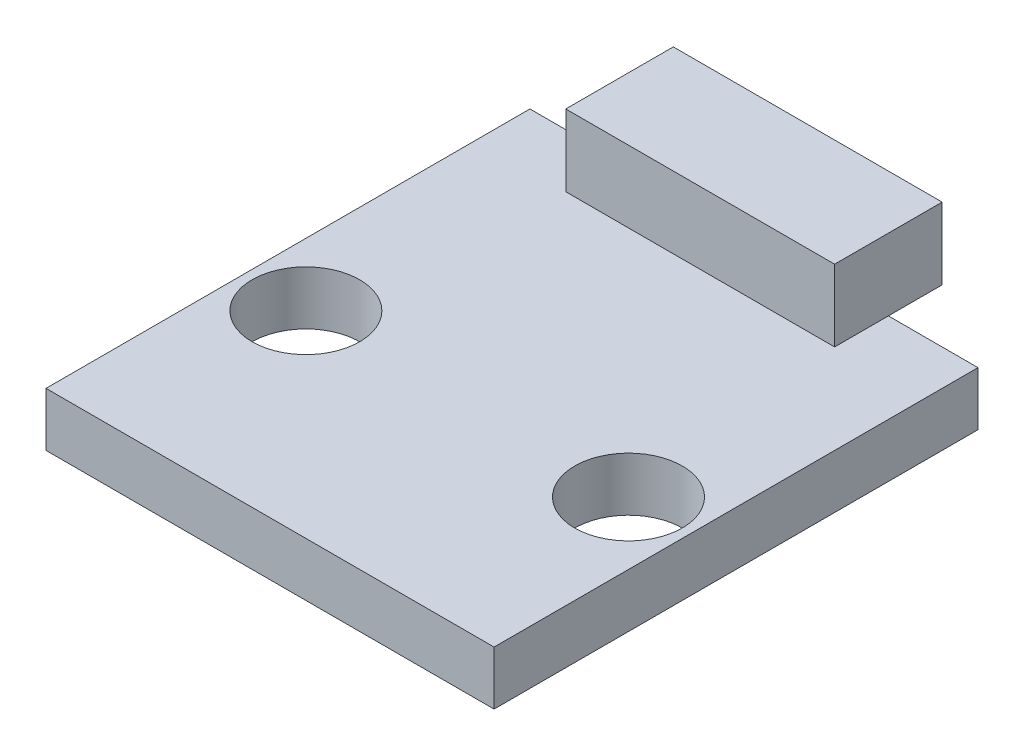
ISO-10303-21;
HEADER;
FILE_DESCRIPTION(('STEP AP214'),'2;1');
FILE_NAME('part.step','',(''),(''),'','','');
FILE_SCHEMA(('AUTOMOTIVE_DESIGN { 1 0 10303 214 1 1 1 1 }'));
ENDSEC;
DATA;
#1=APPLICATION_CONTEXT('core data for automotive mechanical design processes');
#2=APPLICATION_PROTOCOL_DEFINITION('international standard','automotive_design',2000,#1);
#3=PRODUCT_CONTEXT('',#1,'mechanical');
#4=PRODUCT('Part','Part','',(#3));
#5=PRODUCT_RELATED_PRODUCT_CATEGORY('part','',(#4));
#6=PRODUCT_DEFINITION_FORMATION('','',#4);
#7=PRODUCT_DEFINITION_CONTEXT('part definition',#1,'design');
#8=PRODUCT_DEFINITION('design','',#6,#7);
#9=PRODUCT_DEFINITION_SHAPE('','',#8);
#10=(LENGTH_UNIT() NAMED_UNIT(*) SI_UNIT(.MILLI.,.METRE.));
#11=(NAMED_UNIT(*) PLANE_ANGLE_UNIT() SI_UNIT($,.RADIAN.));
#12=(NAMED_UNIT(*) SI_UNIT($,.STERADIAN.) SOLID_ANGLE_UNIT());
#13=UNCERTAINTY_MEASURE_WITH_UNIT(LENGTH_MEASURE(1.E-05),#10,'distance_accuracy_value','');
#14=(GEOMETRIC_REPRESENTATION_CONTEXT(3) GLOBAL_UNCERTAINTY_ASSIGNED_CONTEXT((#13)) GLOBAL_UNIT_ASSIGNED_CONTEXT((#10,
#11,#12)) REPRESENTATION_CONTEXT('',''));
#15=CARTESIAN_POINT('',(0.,0.,0.));
#16=DIRECTION('',(0.,0.,1.));
#17=DIRECTION('',(1.,0.,0.));
#18=AXIS2_PLACEMENT_3D('',#15,#16,#17);
#19=CARTESIAN_POINT('',(0.,1.5,0.));
#20=DIRECTION('',(0.,-1.,0.));
#21=DIRECTION('',(0.,0.,-1.));
#22=AXIS2_PLACEMENT_3D('',#19,#20,#21);
#23=PLANE('',#22);
#24=CARTESIAN_POINT('',(-4.49999999999998,1.5,1.24999999999996));
#25=DIRECTION('',(0.,1.,0.));
#26=DIRECTION('',(0.,0.,1.));
#27=AXIS2_PLACEMENT_3D('',#24,#25,#26);
#28=CIRCLE('',#27,1.5);
#29=CARTESIAN_POINT('',(-4.49999999999998,1.5,2.74999999999997));
#30=VERTEX_POINT('',#29);
#31=EDGE_CURVE('E214',#30,#30,#28,.T.);
#32=ORIENTED_EDGE('',*,*,#31,.F.);
#33=EDGE_LOOP('',(#32));
#34=FACE_BOUND('',#33,.T.);
#35=CARTESIAN_POINT('',(4.50000000000002,1.5,1.24999999999996));
#36=DIRECTION('',(0.,1.,0.));
#37=DIRECTION('',(0.,0.,1.));
#38=AXIS2_PLACEMENT_3D('',#35,#36,#37);
#39=CIRCLE('',#38,1.5);
#40=CARTESIAN_POINT('',(4.50000000000002,1.5,2.74999999999996));
#41=VERTEX_POINT('',#40);
#42=EDGE_CURVE('E224',#41,#41,#39,.T.);
#43=ORIENTED_EDGE('',*,*,#42,.F.);
#44=EDGE_LOOP('',(#43));
#45=FACE_BOUND('',#44,.T.);
#46=DIRECTION('',(0.,0.,-1.));
#47=VECTOR('',#46,1.);
#48=CARTESIAN_POINT('',(3.75000000000002,1.5,-5.25000000000005));
#49=LINE('',#48,#47);
#50=CARTESIAN_POINT('',(3.75000000000002,1.5,-5.25000000000005));
#51=VERTEX_POINT('',#50);
#52=CARTESIAN_POINT('',(3.75000000000002,1.5,-6.75000000000005));
#53=VERTEX_POINT('',#52);
#54=EDGE_CURVE('E63',#51,#53,#49,.T.);
#55=ORIENTED_EDGE('',*,*,#54,.F.);
#56=DIRECTION('',(1.,0.,0.));
#57=VECTOR('',#56,1.);
#58=CARTESIAN_POINT('',(-3.74999999999998,1.5,-5.25000000000005));
#59=LINE('',#58,#57);
#60=CARTESIAN_POINT('',(-3.74999999999998,1.5,-5.25000000000005));
#61=VERTEX_POINT('',#60);
#62=EDGE_CURVE('E137',#61,#51,#59,.T.);
#63=ORIENTED_EDGE('',*,*,#62,.F.);
#64=DIRECTION('',(0.,0.,1.));
#65=VECTOR('',#64,1.);
#66=CARTESIAN_POINT('',(-3.74999999999998,1.5,-5.25000000000005));
#67=LINE('',#66,#65);
#68=CARTESIAN_POINT('',(-3.74999999999998,1.5,-6.75000000000005));
#69=VERTEX_POINT('',#68);
#70=EDGE_CURVE('E13',#69,#61,#67,.T.);
#71=ORIENTED_EDGE('',*,*,#70,.F.);
#72=DIRECTION('',(1.,0.,0.));
#73=VECTOR('',#72,1.);
#74=CARTESIAN_POINT('',(-6.24999999999998,1.5,-6.75000000000005));
#75=LINE('',#74,#73);
#76=CARTESIAN_POINT('',(-6.24999999999998,1.5,-6.75000000000005));
#77=VERTEX_POINT('',#76);
#78=EDGE_CURVE('E156',#77,#69,#75,.T.);
#79=ORIENTED_EDGE('',*,*,#78,.F.);
#80=DIRECTION('',(0.,0.,-1.));
#81=VECTOR('',#80,1.);
#82=CARTESIAN_POINT('',(-6.24999999999998,1.5,6.74999999999996));
#83=LINE('',#82,#81);
#84=CARTESIAN_POINT('',(-6.24999999999998,1.5,6.74999999999996));
#85=VERTEX_POINT('',#84);
#86=EDGE_CURVE('E152',#85,#77,#83,.T.);
#87=ORIENTED_EDGE('',*,*,#86,.F.);
#88=DIRECTION('',(1.,0.,0.));
#89=VECTOR('',#88,1.);
#90=CARTESIAN_POINT('',(-6.24999999999998,1.5,6.74999999999996));
#91=LINE('',#90,#89);
#92=CARTESIAN_POINT('',(6.25000000000002,1.5,6.74999999999996));
#93=VERTEX_POINT('',#92);
#94=EDGE_CURVE('E162',#85,#93,#91,.T.);
#95=ORIENTED_EDGE('',*,*,#94,.T.);
#96=DIRECTION('',(0.,0.,-1.));
#97=VECTOR('',#96,1.);
#98=CARTESIAN_POINT('',(6.25000000000002,1.5,6.74999999999996));
#99=LINE('',#98,#97);
#100=CARTESIAN_POINT('',(6.25000000000002,1.5,-6.75000000000005));
#101=VERTEX_POINT('',#100);
#102=EDGE_CURVE('E159',#93,#101,#99,.T.);
#103=ORIENTED_EDGE('',*,*,#102,.T.);
#104=EDGE_CURVE('E68',#53,#101,#75,.T.);
#105=ORIENTED_EDGE('',*,*,#104,.F.);
#106=EDGE_LOOP('',(#55,#63,#71,#79,#87,#95,#103,#105));
#107=FACE_BOUND('',#106,.T.);
#108=ADVANCED_FACE('F45',(#34,#45,#107),#23,.F.);
#109=CARTESIAN_POINT('',(-6.24999999999998,1.5,6.74999999999996));
#110=DIRECTION('',(-1.,0.,0.));
#111=DIRECTION('',(0.,0.,1.));
#112=AXIS2_PLACEMENT_3D('',#109,#110,#111);
#113=PLANE('',#112);
#114=DIRECTION('',(0.,0.,-1.));
#115=VECTOR('',#114,1.);
#116=CARTESIAN_POINT('',(-6.24999999999998,0.,6.74999999999996));
#117=LINE('',#116,#115);
#118=CARTESIAN_POINT('',(-6.24999999999998,0.,6.74999999999996));
#119=VERTEX_POINT('',#118);
#120=CARTESIAN_POINT('',(-6.24999999999998,0.,-6.75000000000005));
#121=VERTEX_POINT('',#120);
#122=EDGE_CURVE('E143',#119,#121,#117,.T.);
#123=ORIENTED_EDGE('',*,*,#122,.F.);
#124=DIRECTION('',(0.,-1.,0.));
#125=VECTOR('',#124,1.);
#126=CARTESIAN_POINT('',(-6.24999999999998,1.5,6.74999999999996));
#127=LINE('',#126,#125);
#128=EDGE_CURVE('E54',#85,#119,#127,.T.);
#129=ORIENTED_EDGE('',*,*,#128,.F.);
#130=ORIENTED_EDGE('',*,*,#86,.T.);
#131=DIRECTION('',(0.,-1.,0.));
#132=VECTOR('',#131,1.);
#133=CARTESIAN_POINT('',(-6.24999999999998,1.5,-6.75000000000005));
#134=LINE('',#133,#132);
#135=EDGE_CURVE('E49',#77,#121,#134,.T.);
#136=ORIENTED_EDGE('',*,*,#135,.T.);
#137=EDGE_LOOP('',(#123,#129,#130,#136));
#138=FACE_BOUND('',#137,.T.);
#139=ADVANCED_FACE('F47',(#138),#113,.T.);
#140=CARTESIAN_POINT('',(-6.24999999999998,1.5,6.74999999999996));
#141=DIRECTION('',(0.,0.,-1.));
#142=DIRECTION('',(-1.,0.,0.));
#143=AXIS2_PLACEMENT_3D('',#140,#141,#142);
#144=PLANE('',#143);
#145=DIRECTION('',(1.,0.,0.));
#146=VECTOR('',#145,1.);
#147=CARTESIAN_POINT('',(-6.24999999999998,0.,6.74999999999996));
#148=LINE('',#147,#146);
#149=CARTESIAN_POINT('',(6.25000000000002,0.,6.74999999999996));
#150=VERTEX_POINT('',#149);
#151=EDGE_CURVE('E155',#119,#150,#148,.T.);
#152=ORIENTED_EDGE('',*,*,#151,.T.);
#153=DIRECTION('',(0.,-1.,0.));
#154=VECTOR('',#153,1.);
#155=CARTESIAN_POINT('',(6.25000000000002,1.5,6.74999999999996));
#156=LINE('',#155,#154);
#157=EDGE_CURVE('E171',#93,#150,#156,.T.);
#158=ORIENTED_EDGE('',*,*,#157,.F.);
#159=ORIENTED_EDGE('',*,*,#94,.F.);
#160=ORIENTED_EDGE('',*,*,#128,.T.);
#161=EDGE_LOOP('',(#152,#158,#159,#160));
#162=FACE_BOUND('',#161,.T.);
#163=ADVANCED_FACE('F188',(#162),#144,.F.);
#164=CARTESIAN_POINT('',(6.25000000000002,1.5,6.74999999999996));
#165=DIRECTION('',(-1.,0.,0.));
#166=DIRECTION('',(0.,0.,1.));
#167=AXIS2_PLACEMENT_3D('',#164,#165,#166);
#168=PLANE('',#167);
#169=DIRECTION('',(0.,0.,-1.));
#170=VECTOR('',#169,1.);
#171=CARTESIAN_POINT('',(6.25000000000002,0.,6.74999999999996));
#172=LINE('',#171,#170);
#173=CARTESIAN_POINT('',(6.25000000000002,0.,-6.75000000000005));
#174=VERTEX_POINT('',#173);
#175=EDGE_CURVE('E166',#150,#174,#172,.T.);
#176=ORIENTED_EDGE('',*,*,#175,.T.);
#177=DIRECTION('',(0.,-1.,0.));
#178=VECTOR('',#177,1.);
#179=CARTESIAN_POINT('',(6.25000000000002,1.5,-6.75000000000005));
#180=LINE('',#179,#178);
#181=EDGE_CURVE('E173',#101,#174,#180,.T.);
#182=ORIENTED_EDGE('',*,*,#181,.F.);
#183=ORIENTED_EDGE('',*,*,#102,.F.);
#184=ORIENTED_EDGE('',*,*,#157,.T.);
#185=EDGE_LOOP('',(#176,#182,#183,#184));
#186=FACE_BOUND('',#185,.T.);
#187=ADVANCED_FACE('F192',(#186),#168,.F.);
#188=CARTESIAN_POINT('',(-6.24999999999998,1.5,-6.75000000000005));
#189=DIRECTION('',(0.,0.,-1.));
#190=DIRECTION('',(-1.,0.,0.));
#191=AXIS2_PLACEMENT_3D('',#188,#189,#190);
#192=PLANE('',#191);
#193=DIRECTION('',(1.,0.,0.));
#194=VECTOR('',#193,1.);
#195=CARTESIAN_POINT('',(-6.24999999999998,0.,-6.75000000000005));
#196=LINE('',#195,#194);
#197=EDGE_CURVE('E146',#121,#174,#196,.T.);
#198=ORIENTED_EDGE('',*,*,#197,.F.);
#199=ORIENTED_EDGE('',*,*,#135,.F.);
#200=ORIENTED_EDGE('',*,*,#78,.T.);
#201=EDGE_CURVE('E160',#69,#53,#75,.T.);
#202=ORIENTED_EDGE('',*,*,#201,.T.);
#203=ORIENTED_EDGE('',*,*,#104,.T.);
#204=ORIENTED_EDGE('',*,*,#181,.T.);
#205=EDGE_LOOP('',(#198,#199,#200,#202,#203,#204));
#206=FACE_BOUND('',#205,.T.);
#207=ADVANCED_FACE('F181',(#206),#192,.T.);
#208=CARTESIAN_POINT('',(0.,0.,0.));
#209=DIRECTION('',(0.,-1.,0.));
#210=DIRECTION('',(0.,0.,-1.));
#211=AXIS2_PLACEMENT_3D('',#208,#209,#210);
#212=PLANE('',#211);
#213=CARTESIAN_POINT('',(-4.49999999999998,0.,1.24999999999996));
#214=DIRECTION('',(0.,1.,0.));
#215=DIRECTION('',(0.,0.,1.));
#216=AXIS2_PLACEMENT_3D('',#213,#214,#215);
#217=CIRCLE('',#216,1.5);
#218=CARTESIAN_POINT('',(-4.49999999999998,0.,2.74999999999997));
#219=VERTEX_POINT('',#218);
#220=EDGE_CURVE('E212',#219,#219,#217,.T.);
#221=ORIENTED_EDGE('',*,*,#220,.T.);
#222=EDGE_LOOP('',(#221));
#223=FACE_BOUND('',#222,.T.);
#224=CARTESIAN_POINT('',(4.50000000000002,0.,1.24999999999996));
#225=DIRECTION('',(0.,1.,0.));
#226=DIRECTION('',(0.,0.,1.));
#227=AXIS2_PLACEMENT_3D('',#224,#225,#226);
#228=CIRCLE('',#227,1.5);
#229=CARTESIAN_POINT('',(4.50000000000002,0.,2.74999999999996));
#230=VERTEX_POINT('',#229);
#231=EDGE_CURVE('E219',#230,#230,#228,.T.);
#232=ORIENTED_EDGE('',*,*,#231,.T.);
#233=EDGE_LOOP('',(#232));
#234=FACE_BOUND('',#233,.T.);
#235=ORIENTED_EDGE('',*,*,#122,.T.);
#236=ORIENTED_EDGE('',*,*,#197,.T.);
#237=ORIENTED_EDGE('',*,*,#175,.F.);
#238=ORIENTED_EDGE('',*,*,#151,.F.);
#239=EDGE_LOOP('',(#235,#236,#237,#238));
#240=FACE_BOUND('',#239,.T.);
#241=ADVANCED_FACE('F185',(#223,#234,#240),#212,.T.);
#242=CARTESIAN_POINT('',(0.,1.5,0.));
#243=DIRECTION('',(0.,-1.,0.));
#244=DIRECTION('',(0.,0.,-1.));
#245=AXIS2_PLACEMENT_3D('',#242,#243,#244);
#246=PLANE('',#245);
#247=ORIENTED_EDGE('',*,*,#201,.F.);
#248=CARTESIAN_POINT('',(-3.74999999999998,1.5,-8.25000000000005));
#249=VERTEX_POINT('',#248);
#250=EDGE_CURVE('E56',#249,#69,#67,.T.);
#251=ORIENTED_EDGE('',*,*,#250,.F.);
#252=DIRECTION('',(-1.,0.,0.));
#253=VECTOR('',#252,1.);
#254=CARTESIAN_POINT('',(-3.74999999999998,1.5,-8.25000000000005));
#255=LINE('',#254,#253);
#256=CARTESIAN_POINT('',(3.75000000000002,1.5,-8.25000000000005));
#257=VERTEX_POINT('',#256);
#258=EDGE_CURVE('E202',#257,#249,#255,.T.);
#259=ORIENTED_EDGE('',*,*,#258,.F.);
#260=EDGE_CURVE('E141',#53,#257,#49,.T.);
#261=ORIENTED_EDGE('',*,*,#260,.F.);
#262=EDGE_LOOP('',(#247,#251,#259,#261));
#263=FACE_BOUND('',#262,.T.);
#264=ADVANCED_FACE('F197',(#263),#246,.T.);
#265=CARTESIAN_POINT('',(3.75000000000002,3.5,-5.25000000000005));
#266=DIRECTION('',(-1.,0.,0.));
#267=DIRECTION('',(0.,0.,1.));
#268=AXIS2_PLACEMENT_3D('',#265,#266,#267);
#269=PLANE('',#268);
#270=ORIENTED_EDGE('',*,*,#54,.T.);
#271=ORIENTED_EDGE('',*,*,#260,.T.);
#272=DIRECTION('',(0.,-1.,0.));
#273=VECTOR('',#272,1.);
#274=CARTESIAN_POINT('',(3.75000000000002,3.5,-8.25000000000005));
#275=LINE('',#274,#273);
#276=CARTESIAN_POINT('',(3.75000000000002,3.5,-8.25000000000005));
#277=VERTEX_POINT('',#276);
#278=EDGE_CURVE('E122',#277,#257,#275,.T.);
#279=ORIENTED_EDGE('',*,*,#278,.F.);
#280=DIRECTION('',(0.,0.,-1.));
#281=VECTOR('',#280,1.);
#282=CARTESIAN_POINT('',(3.75000000000002,3.5,-5.25000000000005));
#283=LINE('',#282,#281);
#284=CARTESIAN_POINT('',(3.75000000000002,3.5,-5.25000000000005));
#285=VERTEX_POINT('',#284);
#286=EDGE_CURVE('E128',#285,#277,#283,.T.);
#287=ORIENTED_EDGE('',*,*,#286,.F.);
#288=DIRECTION('',(0.,-1.,0.));
#289=VECTOR('',#288,1.);
#290=CARTESIAN_POINT('',(3.75000000000002,3.5,-5.25000000000005));
#291=LINE('',#290,#289);
#292=EDGE_CURVE('E207',#285,#51,#291,.T.);
#293=ORIENTED_EDGE('',*,*,#292,.T.);
#294=EDGE_LOOP('',(#270,#271,#279,#287,#293));
#295=FACE_BOUND('',#294,.T.);
#296=ADVANCED_FACE('F139',(#295),#269,.F.);
#297=CARTESIAN_POINT('',(-3.74999999999998,3.5,-8.25000000000005));
#298=DIRECTION('',(0.,0.,1.));
#299=DIRECTION('',(1.,0.,0.));
#300=AXIS2_PLACEMENT_3D('',#297,#298,#299);
#301=PLANE('',#300);
#302=ORIENTED_EDGE('',*,*,#258,.T.);
#303=DIRECTION('',(0.,-1.,0.));
#304=VECTOR('',#303,1.);
#305=CARTESIAN_POINT('',(-3.74999999999998,3.5,-8.25000000000005));
#306=LINE('',#305,#304);
#307=CARTESIAN_POINT('',(-3.74999999999998,3.5,-8.25000000000005));
#308=VERTEX_POINT('',#307);
#309=EDGE_CURVE('E124',#308,#249,#306,.T.);
#310=ORIENTED_EDGE('',*,*,#309,.F.);
#311=DIRECTION('',(-1.,0.,0.));
#312=VECTOR('',#311,1.);
#313=CARTESIAN_POINT('',(-3.74999999999998,3.5,-8.25000000000005));
#314=LINE('',#313,#312);
#315=EDGE_CURVE('E118',#277,#308,#314,.T.);
#316=ORIENTED_EDGE('',*,*,#315,.F.);
#317=ORIENTED_EDGE('',*,*,#278,.T.);
#318=EDGE_LOOP('',(#302,#310,#316,#317));
#319=FACE_BOUND('',#318,.T.);
#320=ADVANCED_FACE('F120',(#319),#301,.F.);
#321=CARTESIAN_POINT('',(-3.74999999999998,3.5,-5.25000000000005));
#322=DIRECTION('',(1.,0.,0.));
#323=DIRECTION('',(0.,0.,-1.));
#324=AXIS2_PLACEMENT_3D('',#321,#322,#323);
#325=PLANE('',#324);
#326=ORIENTED_EDGE('',*,*,#250,.T.);
#327=ORIENTED_EDGE('',*,*,#70,.T.);
#328=DIRECTION('',(0.,-1.,0.));
#329=VECTOR('',#328,1.);
#330=CARTESIAN_POINT('',(-3.74999999999998,3.5,-5.25000000000005));
#331=LINE('',#330,#329);
#332=CARTESIAN_POINT('',(-3.74999999999998,3.5,-5.25000000000005));
#333=VERTEX_POINT('',#332);
#334=EDGE_CURVE('E148',#333,#61,#331,.T.);
#335=ORIENTED_EDGE('',*,*,#334,.F.);
#336=DIRECTION('',(0.,0.,1.));
#337=VECTOR('',#336,1.);
#338=CARTESIAN_POINT('',(-3.74999999999998,3.5,-5.25000000000005));
#339=LINE('',#338,#337);
#340=EDGE_CURVE('E127',#308,#333,#339,.T.);
#341=ORIENTED_EDGE('',*,*,#340,.F.);
#342=ORIENTED_EDGE('',*,*,#309,.T.);
#343=EDGE_LOOP('',(#326,#327,#335,#341,#342));
#344=FACE_BOUND('',#343,.T.);
#345=ADVANCED_FACE('F199',(#344),#325,.F.);
#346=CARTESIAN_POINT('',(-3.74999999999998,3.5,-5.25000000000005));
#347=DIRECTION('',(0.,0.,-1.));
#348=DIRECTION('',(-1.,0.,0.));
#349=AXIS2_PLACEMENT_3D('',#346,#347,#348);
#350=PLANE('',#349);
#351=ORIENTED_EDGE('',*,*,#62,.T.);
#352=ORIENTED_EDGE('',*,*,#292,.F.);
#353=DIRECTION('',(1.,0.,0.));
#354=VECTOR('',#353,1.);
#355=CARTESIAN_POINT('',(-3.74999999999998,3.5,-5.25000000000005));
#356=LINE('',#355,#354);
#357=EDGE_CURVE('E133',#333,#285,#356,.T.);
#358=ORIENTED_EDGE('',*,*,#357,.F.);
#359=ORIENTED_EDGE('',*,*,#334,.T.);
#360=EDGE_LOOP('',(#351,#352,#358,#359));
#361=FACE_BOUND('',#360,.T.);
#362=ADVANCED_FACE('F209',(#361),#350,.F.);
#363=CARTESIAN_POINT('',(0.,3.5,0.));
#364=DIRECTION('',(0.,-1.,0.));
#365=DIRECTION('',(0.,0.,-1.));
#366=AXIS2_PLACEMENT_3D('',#363,#364,#365);
#367=PLANE('',#366);
#368=ORIENTED_EDGE('',*,*,#286,.T.);
#369=ORIENTED_EDGE('',*,*,#315,.T.);
#370=ORIENTED_EDGE('',*,*,#340,.T.);
#371=ORIENTED_EDGE('',*,*,#357,.T.);
#372=EDGE_LOOP('',(#368,#369,#370,#371));
#373=FACE_BOUND('',#372,.T.);
#374=ADVANCED_FACE('F131',(#373),#367,.F.);
#375=CARTESIAN_POINT('',(4.50000000000002,0.,1.24999999999996));
#376=DIRECTION('',(0.,1.,0.));
#377=DIRECTION('',(0.,0.,1.));
#378=AXIS2_PLACEMENT_3D('',#375,#376,#377);
#379=CYLINDRICAL_SURFACE('',#378,1.5);
#380=ORIENTED_EDGE('',*,*,#231,.F.);
#381=EDGE_LOOP('',(#380));
#382=FACE_BOUND('',#381,.T.);
#383=ORIENTED_EDGE('',*,*,#42,.T.);
#384=EDGE_LOOP('',(#383));
#385=FACE_BOUND('',#384,.T.);
#386=ADVANCED_FACE('F228',(#382,#385),#379,.F.);
#387=CARTESIAN_POINT('',(-4.49999999999998,0.,1.24999999999996));
#388=DIRECTION('',(0.,1.,0.));
#389=DIRECTION('',(0.,0.,1.));
#390=AXIS2_PLACEMENT_3D('',#387,#388,#389);
#391=CYLINDRICAL_SURFACE('',#390,1.5);
#392=ORIENTED_EDGE('',*,*,#220,.F.);
#393=EDGE_LOOP('',(#392));
#394=FACE_BOUND('',#393,.T.);
#395=ORIENTED_EDGE('',*,*,#31,.T.);
#396=EDGE_LOOP('',(#395));
#397=FACE_BOUND('',#396,.T.);
#398=ADVANCED_FACE('F294',(#394,#397),#391,.F.);
#399=CLOSED_SHELL('',(#108,#139,#163,#187,#207,#241,#264,#296,#320,#345,#362,#374,#386,#398));
#400=MANIFOLD_SOLID_BREP('B2',#399);
#401=ADVANCED_BREP_SHAPE_REPRESENTATION('',(#18,#400),#14);
#402=SHAPE_DEFINITION_REPRESENTATION(#9,#401);
ENDSEC;
END-ISO-10303-21;
